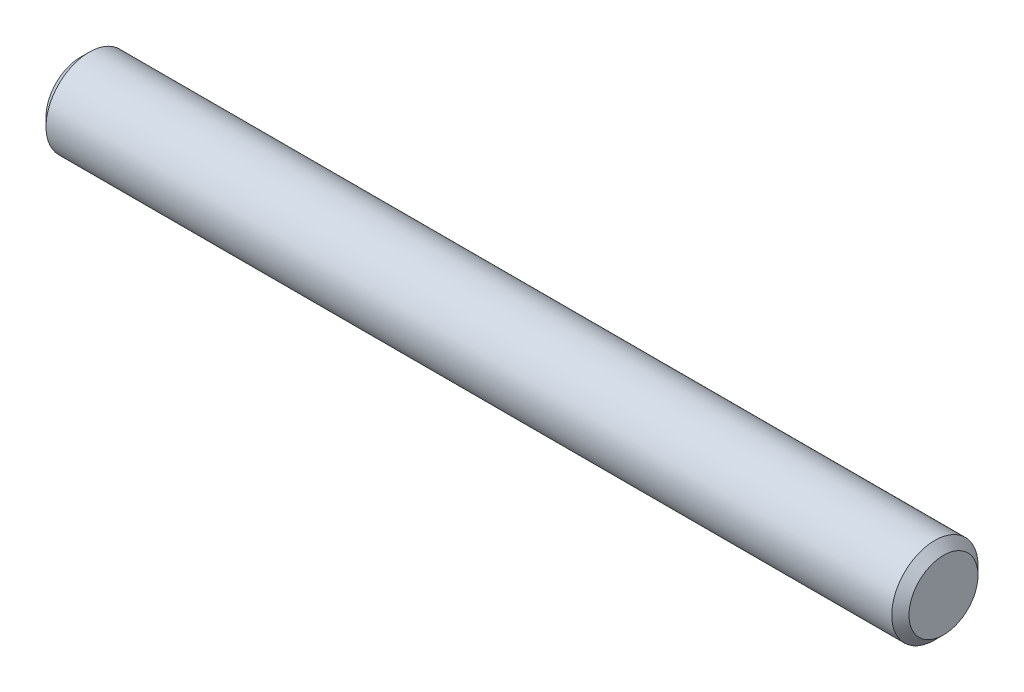
ISO-10303-21;
HEADER;
FILE_DESCRIPTION(('STEP AP214'),'2;1');
FILE_NAME('part.step','',(''),(''),'','','');
FILE_SCHEMA(('AUTOMOTIVE_DESIGN { 1 0 10303 214 1 1 1 1 }'));
ENDSEC;
DATA;
#1=APPLICATION_CONTEXT('core data for automotive mechanical design processes');
#2=APPLICATION_PROTOCOL_DEFINITION('international standard','automotive_design',2000,#1);
#3=PRODUCT_CONTEXT('',#1,'mechanical');
#4=PRODUCT('Part','Part','',(#3));
#5=PRODUCT_RELATED_PRODUCT_CATEGORY('part','',(#4));
#6=PRODUCT_DEFINITION_FORMATION('','',#4);
#7=PRODUCT_DEFINITION_CONTEXT('part definition',#1,'design');
#8=PRODUCT_DEFINITION('design','',#6,#7);
#9=PRODUCT_DEFINITION_SHAPE('','',#8);
#10=(LENGTH_UNIT() NAMED_UNIT(*) SI_UNIT(.MILLI.,.METRE.));
#11=(NAMED_UNIT(*) PLANE_ANGLE_UNIT() SI_UNIT($,.RADIAN.));
#12=(NAMED_UNIT(*) SI_UNIT($,.STERADIAN.) SOLID_ANGLE_UNIT());
#13=UNCERTAINTY_MEASURE_WITH_UNIT(LENGTH_MEASURE(1.E-05),#10,'distance_accuracy_value','');
#14=(GEOMETRIC_REPRESENTATION_CONTEXT(3) GLOBAL_UNCERTAINTY_ASSIGNED_CONTEXT((#13)) GLOBAL_UNIT_ASSIGNED_CONTEXT((#10,
#11,#12)) REPRESENTATION_CONTEXT('',''));
#15=CARTESIAN_POINT('',(0.,0.,0.));
#16=DIRECTION('',(0.,0.,1.));
#17=DIRECTION('',(1.,0.,0.));
#18=AXIS2_PLACEMENT_3D('',#15,#16,#17);
#19=CARTESIAN_POINT('',(-31.75,0.,0.));
#20=DIRECTION('',(1.,0.,0.));
#21=DIRECTION('',(0.,0.,-1.));
#22=AXIS2_PLACEMENT_3D('',#19,#20,#21);
#23=CYLINDRICAL_SURFACE('',#22,3.175);
#24=CARTESIAN_POINT('',(31.115,0.,0.));
#25=DIRECTION('',(1.,0.,0.));
#26=DIRECTION('',(0.,0.,-1.));
#27=AXIS2_PLACEMENT_3D('',#24,#25,#26);
#28=CIRCLE('',#27,3.175);
#29=CARTESIAN_POINT('',(31.115,0.,-3.175));
#30=VERTEX_POINT('',#29);
#31=EDGE_CURVE('E49',#30,#30,#28,.F.);
#32=ORIENTED_EDGE('',*,*,#31,.T.);
#33=EDGE_LOOP('',(#32));
#34=FACE_BOUND('',#33,.T.);
#35=CARTESIAN_POINT('',(-31.115,0.,0.));
#36=DIRECTION('',(1.,0.,0.));
#37=DIRECTION('',(0.,0.,-1.));
#38=AXIS2_PLACEMENT_3D('',#35,#36,#37);
#39=CIRCLE('',#38,3.175);
#40=CARTESIAN_POINT('',(-31.115,0.,-3.175));
#41=VERTEX_POINT('',#40);
#42=EDGE_CURVE('E53',#41,#41,#39,.T.);
#43=ORIENTED_EDGE('',*,*,#42,.T.);
#44=EDGE_LOOP('',(#43));
#45=FACE_BOUND('',#44,.T.);
#46=ADVANCED_FACE('F42',(#34,#45),#23,.T.);
#47=CARTESIAN_POINT('',(-31.75,0.,0.));
#48=DIRECTION('',(1.,0.,0.));
#49=DIRECTION('',(0.,0.,-1.));
#50=AXIS2_PLACEMENT_3D('',#47,#48,#49);
#51=PLANE('',#50);
#52=CARTESIAN_POINT('',(-31.75,0.,0.));
#53=DIRECTION('',(1.,0.,0.));
#54=DIRECTION('',(0.,0.,-1.));
#55=AXIS2_PLACEMENT_3D('',#52,#53,#54);
#56=CIRCLE('',#55,2.54);
#57=CARTESIAN_POINT('',(-31.75,0.,-2.54));
#58=VERTEX_POINT('',#57);
#59=EDGE_CURVE('E12',#58,#58,#56,.F.);
#60=ORIENTED_EDGE('',*,*,#59,.T.);
#61=EDGE_LOOP('',(#60));
#62=FACE_BOUND('',#61,.T.);
#63=ADVANCED_FACE('F73',(#62),#51,.F.);
#64=CARTESIAN_POINT('',(31.75,0.,0.));
#65=DIRECTION('',(1.,0.,0.));
#66=DIRECTION('',(0.,0.,-1.));
#67=AXIS2_PLACEMENT_3D('',#64,#65,#66);
#68=PLANE('',#67);
#69=CARTESIAN_POINT('',(31.75,0.,0.));
#70=DIRECTION('',(1.,0.,0.));
#71=DIRECTION('',(0.,0.,-1.));
#72=AXIS2_PLACEMENT_3D('',#69,#70,#71);
#73=CIRCLE('',#72,2.53999999999999);
#74=CARTESIAN_POINT('',(31.75,0.,-2.53999999999999));
#75=VERTEX_POINT('',#74);
#76=EDGE_CURVE('E57',#75,#75,#73,.T.);
#77=ORIENTED_EDGE('',*,*,#76,.T.);
#78=EDGE_LOOP('',(#77));
#79=FACE_BOUND('',#78,.T.);
#80=ADVANCED_FACE('F63',(#79),#68,.T.);
#81=CARTESIAN_POINT('',(31.75,0.,0.));
#82=DIRECTION('',(-1.,0.,0.));
#83=DIRECTION('',(0.,0.,1.));
#84=AXIS2_PLACEMENT_3D('',#81,#82,#83);
#85=CONICAL_SURFACE('',#84,2.53999999999999,0.785398163397445);
#86=ORIENTED_EDGE('',*,*,#31,.F.);
#87=EDGE_LOOP('',(#86));
#88=FACE_BOUND('',#87,.T.);
#89=ORIENTED_EDGE('',*,*,#76,.F.);
#90=EDGE_LOOP('',(#89));
#91=FACE_BOUND('',#90,.T.);
#92=ADVANCED_FACE('F65',(#88,#91),#85,.T.);
#93=CARTESIAN_POINT('',(-31.115,0.,0.));
#94=DIRECTION('',(1.,0.,0.));
#95=DIRECTION('',(0.,0.,-1.));
#96=AXIS2_PLACEMENT_3D('',#93,#94,#95);
#97=CONICAL_SURFACE('',#96,3.175,0.78539816339745);
#98=ORIENTED_EDGE('',*,*,#59,.F.);
#99=EDGE_LOOP('',(#98));
#100=FACE_BOUND('',#99,.T.);
#101=ORIENTED_EDGE('',*,*,#42,.F.);
#102=EDGE_LOOP('',(#101));
#103=FACE_BOUND('',#102,.T.);
#104=ADVANCED_FACE('F44',(#100,#103),#97,.T.);
#105=CLOSED_SHELL('',(#46,#63,#80,#92,#104));
#106=MANIFOLD_SOLID_BREP('B2',#105);
#107=ADVANCED_BREP_SHAPE_REPRESENTATION('',(#18,#106),#14);
#108=SHAPE_DEFINITION_REPRESENTATION(#9,#107);
ENDSEC;
END-ISO-10303-21;
